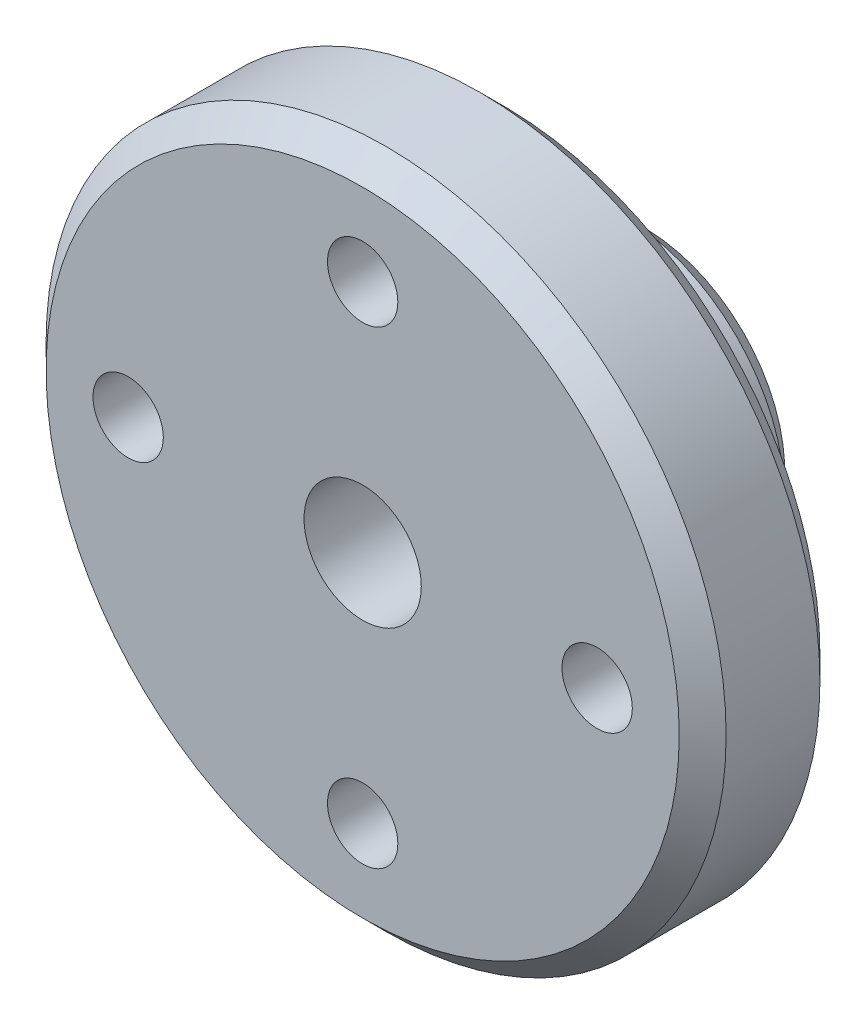
ISO-10303-21;
HEADER;
FILE_DESCRIPTION(('STEP AP214'),'2;1');
FILE_NAME('part.step','',(''),(''),'','','');
FILE_SCHEMA(('AUTOMOTIVE_DESIGN { 1 0 10303 214 1 1 1 1 }'));
ENDSEC;
DATA;
#1=APPLICATION_CONTEXT('core data for automotive mechanical design processes');
#2=APPLICATION_PROTOCOL_DEFINITION('international standard','automotive_design',2000,#1);
#3=PRODUCT_CONTEXT('',#1,'mechanical');
#4=PRODUCT('Part','Part','',(#3));
#5=PRODUCT_RELATED_PRODUCT_CATEGORY('part','',(#4));
#6=PRODUCT_DEFINITION_FORMATION('','',#4);
#7=PRODUCT_DEFINITION_CONTEXT('part definition',#1,'design');
#8=PRODUCT_DEFINITION('design','',#6,#7);
#9=PRODUCT_DEFINITION_SHAPE('','',#8);
#10=(LENGTH_UNIT() NAMED_UNIT(*) SI_UNIT(.MILLI.,.METRE.));
#11=(NAMED_UNIT(*) PLANE_ANGLE_UNIT() SI_UNIT($,.RADIAN.));
#12=(NAMED_UNIT(*) SI_UNIT($,.STERADIAN.) SOLID_ANGLE_UNIT());
#13=UNCERTAINTY_MEASURE_WITH_UNIT(LENGTH_MEASURE(1.E-05),#10,'distance_accuracy_value','');
#14=(GEOMETRIC_REPRESENTATION_CONTEXT(3) GLOBAL_UNCERTAINTY_ASSIGNED_CONTEXT((#13)) GLOBAL_UNIT_ASSIGNED_CONTEXT((#10,
#11,#12)) REPRESENTATION_CONTEXT('',''));
#15=CARTESIAN_POINT('',(0.,0.,0.));
#16=DIRECTION('',(0.,0.,1.));
#17=DIRECTION('',(1.,0.,0.));
#18=AXIS2_PLACEMENT_3D('',#15,#16,#17);
#19=CARTESIAN_POINT('',(0.,0.,3.));
#20=DIRECTION('',(0.,0.,-1.));
#21=DIRECTION('',(-1.,0.,0.));
#22=AXIS2_PLACEMENT_3D('',#19,#20,#21);
#23=CYLINDRICAL_SURFACE('',#22,7.25);
#24=CARTESIAN_POINT('',(0.,0.,2.5));
#25=DIRECTION('',(0.,0.,1.));
#26=DIRECTION('',(1.,0.,0.));
#27=AXIS2_PLACEMENT_3D('',#24,#25,#26);
#28=CIRCLE('',#27,7.25);
#29=CARTESIAN_POINT('',(7.25,0.,2.5));
#30=VERTEX_POINT('',#29);
#31=EDGE_CURVE('E56',#30,#30,#28,.F.);
#32=ORIENTED_EDGE('',*,*,#31,.T.);
#33=EDGE_LOOP('',(#32));
#34=FACE_BOUND('',#33,.T.);
#35=CARTESIAN_POINT('',(0.,0.,0.5));
#36=DIRECTION('',(0.,0.,1.));
#37=DIRECTION('',(1.,0.,0.));
#38=AXIS2_PLACEMENT_3D('',#35,#36,#37);
#39=CIRCLE('',#38,7.25);
#40=CARTESIAN_POINT('',(7.25,0.,0.5));
#41=VERTEX_POINT('',#40);
#42=EDGE_CURVE('E59',#41,#41,#39,.T.);
#43=ORIENTED_EDGE('',*,*,#42,.T.);
#44=EDGE_LOOP('',(#43));
#45=FACE_BOUND('',#44,.T.);
#46=ADVANCED_FACE('F38',(#34,#45),#23,.T.);
#47=CARTESIAN_POINT('',(0.,0.,3.));
#48=DIRECTION('',(0.,0.,1.));
#49=DIRECTION('',(1.,0.,0.));
#50=AXIS2_PLACEMENT_3D('',#47,#48,#49);
#51=PLANE('',#50);
#52=CARTESIAN_POINT('',(0.,0.,3.));
#53=DIRECTION('',(0.,0.,1.));
#54=DIRECTION('',(1.,0.,0.));
#55=AXIS2_PLACEMENT_3D('',#52,#53,#54);
#56=CIRCLE('',#55,1.25);
#57=CARTESIAN_POINT('',(1.25,0.,3.));
#58=VERTEX_POINT('',#57);
#59=EDGE_CURVE('E98',#58,#58,#56,.T.);
#60=ORIENTED_EDGE('',*,*,#59,.F.);
#61=EDGE_LOOP('',(#60));
#62=FACE_BOUND('',#61,.T.);
#63=CARTESIAN_POINT('',(0.,0.,3.));
#64=DIRECTION('',(0.,0.,1.));
#65=DIRECTION('',(1.,0.,0.));
#66=AXIS2_PLACEMENT_3D('',#63,#64,#65);
#67=CIRCLE('',#66,6.75);
#68=CARTESIAN_POINT('',(6.75,0.,3.));
#69=VERTEX_POINT('',#68);
#70=EDGE_CURVE('E62',#69,#69,#67,.T.);
#71=ORIENTED_EDGE('',*,*,#70,.T.);
#72=EDGE_LOOP('',(#71));
#73=FACE_BOUND('',#72,.T.);
#74=CARTESIAN_POINT('',(0.,5.,3.));
#75=DIRECTION('',(0.,0.,1.));
#76=DIRECTION('',(1.,0.,0.));
#77=AXIS2_PLACEMENT_3D('',#74,#75,#76);
#78=CIRCLE('',#77,0.75);
#79=CARTESIAN_POINT('',(0.75,5.,3.));
#80=VERTEX_POINT('',#79);
#81=EDGE_CURVE('E79',#80,#80,#78,.T.);
#82=ORIENTED_EDGE('',*,*,#81,.F.);
#83=EDGE_LOOP('',(#82));
#84=FACE_BOUND('',#83,.T.);
#85=CARTESIAN_POINT('',(5.,0.,3.));
#86=DIRECTION('',(0.,0.,1.));
#87=DIRECTION('',(1.,0.,0.));
#88=AXIS2_PLACEMENT_3D('',#85,#86,#87);
#89=CIRCLE('',#88,0.75);
#90=CARTESIAN_POINT('',(5.75,0.,3.));
#91=VERTEX_POINT('',#90);
#92=EDGE_CURVE('E93',#91,#91,#89,.T.);
#93=ORIENTED_EDGE('',*,*,#92,.F.);
#94=EDGE_LOOP('',(#93));
#95=FACE_BOUND('',#94,.T.);
#96=CARTESIAN_POINT('',(0.,-5.,3.));
#97=DIRECTION('',(0.,0.,1.));
#98=DIRECTION('',(1.,0.,0.));
#99=AXIS2_PLACEMENT_3D('',#96,#97,#98);
#100=CIRCLE('',#99,0.75);
#101=CARTESIAN_POINT('',(0.749999999999965,-5.,3.));
#102=VERTEX_POINT('',#101);
#103=EDGE_CURVE('E90',#102,#102,#100,.T.);
#104=ORIENTED_EDGE('',*,*,#103,.F.);
#105=EDGE_LOOP('',(#104));
#106=FACE_BOUND('',#105,.T.);
#107=CARTESIAN_POINT('',(-5.,0.,3.));
#108=DIRECTION('',(0.,0.,1.));
#109=DIRECTION('',(1.,0.,0.));
#110=AXIS2_PLACEMENT_3D('',#107,#108,#109);
#111=CIRCLE('',#110,0.75);
#112=CARTESIAN_POINT('',(-4.25,0.,3.));
#113=VERTEX_POINT('',#112);
#114=EDGE_CURVE('E87',#113,#113,#111,.T.);
#115=ORIENTED_EDGE('',*,*,#114,.F.);
#116=EDGE_LOOP('',(#115));
#117=FACE_BOUND('',#116,.T.);
#118=ADVANCED_FACE('F118',(#62,#73,#84,#95,#106,#117),#51,.T.);
#119=CARTESIAN_POINT('',(0.,0.,0.));
#120=DIRECTION('',(0.,0.,1.));
#121=DIRECTION('',(1.,0.,0.));
#122=AXIS2_PLACEMENT_3D('',#119,#120,#121);
#123=PLANE('',#122);
#124=CARTESIAN_POINT('',(0.,0.,0.));
#125=DIRECTION('',(0.,0.,1.));
#126=DIRECTION('',(1.,0.,0.));
#127=AXIS2_PLACEMENT_3D('',#124,#125,#126);
#128=CIRCLE('',#127,6.75);
#129=CARTESIAN_POINT('',(6.75,0.,0.));
#130=VERTEX_POINT('',#129);
#131=EDGE_CURVE('E51',#130,#130,#128,.F.);
#132=ORIENTED_EDGE('',*,*,#131,.T.);
#133=EDGE_LOOP('',(#132));
#134=FACE_BOUND('',#133,.T.);
#135=CARTESIAN_POINT('',(0.,5.,0.));
#136=DIRECTION('',(0.,0.,1.));
#137=DIRECTION('',(1.,0.,0.));
#138=AXIS2_PLACEMENT_3D('',#135,#136,#137);
#139=CIRCLE('',#138,0.75);
#140=CARTESIAN_POINT('',(0.75,5.,0.));
#141=VERTEX_POINT('',#140);
#142=EDGE_CURVE('E66',#141,#141,#139,.T.);
#143=ORIENTED_EDGE('',*,*,#142,.T.);
#144=EDGE_LOOP('',(#143));
#145=FACE_BOUND('',#144,.T.);
#146=CARTESIAN_POINT('',(5.,0.,0.));
#147=DIRECTION('',(0.,0.,1.));
#148=DIRECTION('',(1.,0.,0.));
#149=AXIS2_PLACEMENT_3D('',#146,#147,#148);
#150=CIRCLE('',#149,0.75);
#151=CARTESIAN_POINT('',(5.75,0.,0.));
#152=VERTEX_POINT('',#151);
#153=EDGE_CURVE('E70',#152,#152,#150,.T.);
#154=ORIENTED_EDGE('',*,*,#153,.T.);
#155=EDGE_LOOP('',(#154));
#156=FACE_BOUND('',#155,.T.);
#157=CARTESIAN_POINT('',(0.,-5.,0.));
#158=DIRECTION('',(0.,0.,1.));
#159=DIRECTION('',(1.,0.,0.));
#160=AXIS2_PLACEMENT_3D('',#157,#158,#159);
#161=CIRCLE('',#160,0.75);
#162=CARTESIAN_POINT('',(0.749999999999965,-5.,0.));
#163=VERTEX_POINT('',#162);
#164=EDGE_CURVE('E73',#163,#163,#161,.T.);
#165=ORIENTED_EDGE('',*,*,#164,.T.);
#166=EDGE_LOOP('',(#165));
#167=FACE_BOUND('',#166,.T.);
#168=CARTESIAN_POINT('',(-5.,0.,0.));
#169=DIRECTION('',(0.,0.,1.));
#170=DIRECTION('',(1.,0.,0.));
#171=AXIS2_PLACEMENT_3D('',#168,#169,#170);
#172=CIRCLE('',#171,0.75);
#173=CARTESIAN_POINT('',(-4.25,0.,0.));
#174=VERTEX_POINT('',#173);
#175=EDGE_CURVE('E76',#174,#174,#172,.T.);
#176=ORIENTED_EDGE('',*,*,#175,.T.);
#177=EDGE_LOOP('',(#176));
#178=FACE_BOUND('',#177,.T.);
#179=CARTESIAN_POINT('',(0.,0.,0.));
#180=DIRECTION('',(0.,0.,1.));
#181=DIRECTION('',(1.,0.,0.));
#182=AXIS2_PLACEMENT_3D('',#179,#180,#181);
#183=CIRCLE('',#182,3.5);
#184=CARTESIAN_POINT('',(3.5,0.,0.));
#185=VERTEX_POINT('',#184);
#186=EDGE_CURVE('E65',#185,#185,#183,.F.);
#187=ORIENTED_EDGE('',*,*,#186,.F.);
#188=EDGE_LOOP('',(#187));
#189=FACE_BOUND('',#188,.T.);
#190=ADVANCED_FACE('F124',(#134,#145,#156,#167,#178,#189),#123,.F.);
#191=CARTESIAN_POINT('',(0.,0.,-3.));
#192=DIRECTION('',(0.,0.,-1.));
#193=DIRECTION('',(-1.,0.,0.));
#194=AXIS2_PLACEMENT_3D('',#191,#192,#193);
#195=PLANE('',#194);
#196=CARTESIAN_POINT('',(0.,0.,-3.));
#197=DIRECTION('',(0.,0.,-1.));
#198=DIRECTION('',(-1.,0.,0.));
#199=AXIS2_PLACEMENT_3D('',#196,#197,#198);
#200=CIRCLE('',#199,3.);
#201=CARTESIAN_POINT('',(-3.,0.,-3.));
#202=VERTEX_POINT('',#201);
#203=EDGE_CURVE('E47',#202,#202,#200,.T.);
#204=ORIENTED_EDGE('',*,*,#203,.T.);
#205=EDGE_LOOP('',(#204));
#206=FACE_BOUND('',#205,.T.);
#207=CARTESIAN_POINT('',(0.,0.,-3.));
#208=DIRECTION('',(0.,0.,-1.));
#209=DIRECTION('',(-1.,0.,0.));
#210=AXIS2_PLACEMENT_3D('',#207,#208,#209);
#211=CIRCLE('',#210,2.5);
#212=CARTESIAN_POINT('',(-2.5,0.,-3.));
#213=VERTEX_POINT('',#212);
#214=EDGE_CURVE('E82',#213,#213,#211,.T.);
#215=ORIENTED_EDGE('',*,*,#214,.F.);
#216=EDGE_LOOP('',(#215));
#217=FACE_BOUND('',#216,.T.);
#218=ADVANCED_FACE('F150',(#206,#217),#195,.T.);
#219=CARTESIAN_POINT('',(0.,0.,-3.));
#220=DIRECTION('',(0.,0.,1.));
#221=DIRECTION('',(1.,0.,0.));
#222=AXIS2_PLACEMENT_3D('',#219,#220,#221);
#223=CYLINDRICAL_SURFACE('',#222,3.5);
#224=CARTESIAN_POINT('',(0.,0.,-2.5));
#225=DIRECTION('',(0.,0.,-1.));
#226=DIRECTION('',(-1.,0.,0.));
#227=AXIS2_PLACEMENT_3D('',#224,#225,#226);
#228=CIRCLE('',#227,3.5);
#229=CARTESIAN_POINT('',(-3.5,0.,-2.5));
#230=VERTEX_POINT('',#229);
#231=EDGE_CURVE('E10',#230,#230,#228,.F.);
#232=ORIENTED_EDGE('',*,*,#231,.T.);
#233=EDGE_LOOP('',(#232));
#234=FACE_BOUND('',#233,.T.);
#235=ORIENTED_EDGE('',*,*,#186,.T.);
#236=EDGE_LOOP('',(#235));
#237=FACE_BOUND('',#236,.T.);
#238=ADVANCED_FACE('F161',(#234,#237),#223,.T.);
#239=CARTESIAN_POINT('',(0.,0.,-3.));
#240=DIRECTION('',(0.,0.,1.));
#241=DIRECTION('',(1.,0.,0.));
#242=AXIS2_PLACEMENT_3D('',#239,#240,#241);
#243=CYLINDRICAL_SURFACE('',#242,2.5);
#244=ORIENTED_EDGE('',*,*,#214,.T.);
#245=EDGE_LOOP('',(#244));
#246=FACE_BOUND('',#245,.T.);
#247=CARTESIAN_POINT('',(0.,0.,0.));
#248=DIRECTION('',(0.,0.,-1.));
#249=DIRECTION('',(-1.,0.,0.));
#250=AXIS2_PLACEMENT_3D('',#247,#248,#249);
#251=CIRCLE('',#250,2.5);
#252=CARTESIAN_POINT('',(-2.5,0.,0.));
#253=VERTEX_POINT('',#252);
#254=EDGE_CURVE('E69',#253,#253,#251,.T.);
#255=ORIENTED_EDGE('',*,*,#254,.F.);
#256=EDGE_LOOP('',(#255));
#257=FACE_BOUND('',#256,.T.);
#258=ADVANCED_FACE('F163',(#246,#257),#243,.F.);
#259=CARTESIAN_POINT('',(0.,0.,0.));
#260=DIRECTION('',(0.,0.,1.));
#261=DIRECTION('',(1.,0.,0.));
#262=AXIS2_PLACEMENT_3D('',#259,#260,#261);
#263=CIRCLE('',#262,1.25);
#264=CARTESIAN_POINT('',(1.25,0.,0.));
#265=VERTEX_POINT('',#264);
#266=EDGE_CURVE('E43',#265,#265,#263,.T.);
#267=ORIENTED_EDGE('',*,*,#266,.T.);
#268=EDGE_LOOP('',(#267));
#269=FACE_BOUND('',#268,.T.);
#270=ORIENTED_EDGE('',*,*,#254,.T.);
#271=EDGE_LOOP('',(#270));
#272=FACE_BOUND('',#271,.T.);
#273=ADVANCED_FACE('F105',(#269,#272),#123,.F.);
#274=CARTESIAN_POINT('',(-5.,0.,-3.));
#275=DIRECTION('',(0.,0.,1.));
#276=DIRECTION('',(1.,0.,0.));
#277=AXIS2_PLACEMENT_3D('',#274,#275,#276);
#278=CYLINDRICAL_SURFACE('',#277,0.75);
#279=ORIENTED_EDGE('',*,*,#114,.T.);
#280=EDGE_LOOP('',(#279));
#281=FACE_BOUND('',#280,.T.);
#282=ORIENTED_EDGE('',*,*,#175,.F.);
#283=EDGE_LOOP('',(#282));
#284=FACE_BOUND('',#283,.T.);
#285=ADVANCED_FACE('F174',(#281,#284),#278,.F.);
#286=CARTESIAN_POINT('',(0.,-5.,-3.));
#287=DIRECTION('',(0.,0.,1.));
#288=DIRECTION('',(1.,0.,0.));
#289=AXIS2_PLACEMENT_3D('',#286,#287,#288);
#290=CYLINDRICAL_SURFACE('',#289,0.75);
#291=ORIENTED_EDGE('',*,*,#103,.T.);
#292=EDGE_LOOP('',(#291));
#293=FACE_BOUND('',#292,.T.);
#294=ORIENTED_EDGE('',*,*,#164,.F.);
#295=EDGE_LOOP('',(#294));
#296=FACE_BOUND('',#295,.T.);
#297=ADVANCED_FACE('F177',(#293,#296),#290,.F.);
#298=CARTESIAN_POINT('',(5.,0.,-3.));
#299=DIRECTION('',(0.,0.,1.));
#300=DIRECTION('',(1.,0.,0.));
#301=AXIS2_PLACEMENT_3D('',#298,#299,#300);
#302=CYLINDRICAL_SURFACE('',#301,0.75);
#303=ORIENTED_EDGE('',*,*,#92,.T.);
#304=EDGE_LOOP('',(#303));
#305=FACE_BOUND('',#304,.T.);
#306=ORIENTED_EDGE('',*,*,#153,.F.);
#307=EDGE_LOOP('',(#306));
#308=FACE_BOUND('',#307,.T.);
#309=ADVANCED_FACE('F181',(#305,#308),#302,.F.);
#310=CARTESIAN_POINT('',(0.,5.,-3.));
#311=DIRECTION('',(0.,0.,1.));
#312=DIRECTION('',(1.,0.,0.));
#313=AXIS2_PLACEMENT_3D('',#310,#311,#312);
#314=CYLINDRICAL_SURFACE('',#313,0.75);
#315=ORIENTED_EDGE('',*,*,#81,.T.);
#316=EDGE_LOOP('',(#315));
#317=FACE_BOUND('',#316,.T.);
#318=ORIENTED_EDGE('',*,*,#142,.F.);
#319=EDGE_LOOP('',(#318));
#320=FACE_BOUND('',#319,.T.);
#321=ADVANCED_FACE('F136',(#317,#320),#314,.F.);
#322=CARTESIAN_POINT('',(0.,0.,3.));
#323=DIRECTION('',(0.,0.,-1.));
#324=DIRECTION('',(-1.,0.,0.));
#325=AXIS2_PLACEMENT_3D('',#322,#323,#324);
#326=CONICAL_SURFACE('',#325,6.75,0.785398163397447);
#327=ORIENTED_EDGE('',*,*,#31,.F.);
#328=EDGE_LOOP('',(#327));
#329=FACE_BOUND('',#328,.T.);
#330=ORIENTED_EDGE('',*,*,#70,.F.);
#331=EDGE_LOOP('',(#330));
#332=FACE_BOUND('',#331,.T.);
#333=ADVANCED_FACE('F131',(#329,#332),#326,.T.);
#334=CARTESIAN_POINT('',(0.,0.,0.5));
#335=DIRECTION('',(0.,0.,1.));
#336=DIRECTION('',(1.,0.,0.));
#337=AXIS2_PLACEMENT_3D('',#334,#335,#336);
#338=CONICAL_SURFACE('',#337,7.25,0.785398163397453);
#339=ORIENTED_EDGE('',*,*,#131,.F.);
#340=EDGE_LOOP('',(#339));
#341=FACE_BOUND('',#340,.T.);
#342=ORIENTED_EDGE('',*,*,#42,.F.);
#343=EDGE_LOOP('',(#342));
#344=FACE_BOUND('',#343,.T.);
#345=ADVANCED_FACE('F114',(#341,#344),#338,.T.);
#346=CARTESIAN_POINT('',(0.,0.,-3.));
#347=DIRECTION('',(0.,0.,1.));
#348=DIRECTION('',(1.,0.,0.));
#349=AXIS2_PLACEMENT_3D('',#346,#347,#348);
#350=CONICAL_SURFACE('',#349,3.,0.785398163397445);
#351=ORIENTED_EDGE('',*,*,#231,.F.);
#352=EDGE_LOOP('',(#351));
#353=FACE_BOUND('',#352,.T.);
#354=ORIENTED_EDGE('',*,*,#203,.F.);
#355=EDGE_LOOP('',(#354));
#356=FACE_BOUND('',#355,.T.);
#357=ADVANCED_FACE('F41',(#353,#356),#350,.T.);
#358=CARTESIAN_POINT('',(0.,0.,-3.));
#359=DIRECTION('',(0.,0.,1.));
#360=DIRECTION('',(1.,0.,0.));
#361=AXIS2_PLACEMENT_3D('',#358,#359,#360);
#362=CYLINDRICAL_SURFACE('',#361,1.25);
#363=ORIENTED_EDGE('',*,*,#59,.T.);
#364=EDGE_LOOP('',(#363));
#365=FACE_BOUND('',#364,.T.);
#366=ORIENTED_EDGE('',*,*,#266,.F.);
#367=EDGE_LOOP('',(#366));
#368=FACE_BOUND('',#367,.T.);
#369=ADVANCED_FACE('F108',(#365,#368),#362,.F.);
#370=CLOSED_SHELL('',(#46,#118,#190,#218,#238,#258,#273,#285,#297,#309,#321,#333,#345,#357,#369));
#371=MANIFOLD_SOLID_BREP('B2',#370);
#372=ADVANCED_BREP_SHAPE_REPRESENTATION('',(#18,#371),#14);
#373=SHAPE_DEFINITION_REPRESENTATION(#9,#372);
ENDSEC;
END-ISO-10303-21;
